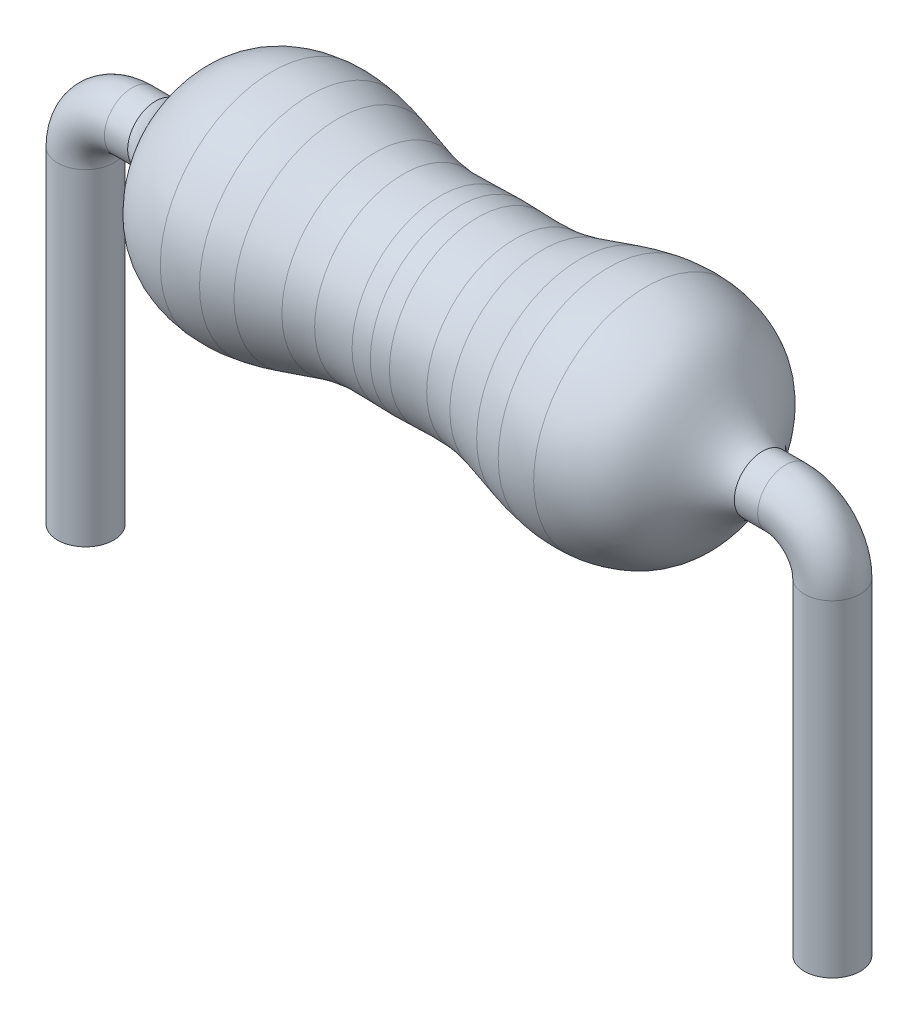
ISO-10303-21;
HEADER;
FILE_DESCRIPTION(('STEP AP214'),'2;1');
FILE_NAME('part.step','',(''),(''),'','','');
FILE_SCHEMA(('AUTOMOTIVE_DESIGN { 1 0 10303 214 1 1 1 1 }'));
ENDSEC;
DATA;
#1=APPLICATION_CONTEXT('core data for automotive mechanical design processes');
#2=APPLICATION_PROTOCOL_DEFINITION('international standard','automotive_design',2000,#1);
#3=PRODUCT_CONTEXT('',#1,'mechanical');
#4=PRODUCT('Part','Part','',(#3));
#5=PRODUCT_RELATED_PRODUCT_CATEGORY('part','',(#4));
#6=PRODUCT_DEFINITION_FORMATION('','',#4);
#7=PRODUCT_DEFINITION_CONTEXT('part definition',#1,'design');
#8=PRODUCT_DEFINITION('design','',#6,#7);
#9=PRODUCT_DEFINITION_SHAPE('','',#8);
#10=(LENGTH_UNIT() NAMED_UNIT(*) SI_UNIT(.MILLI.,.METRE.));
#11=(NAMED_UNIT(*) PLANE_ANGLE_UNIT() SI_UNIT($,.RADIAN.));
#12=(NAMED_UNIT(*) SI_UNIT($,.STERADIAN.) SOLID_ANGLE_UNIT());
#13=UNCERTAINTY_MEASURE_WITH_UNIT(LENGTH_MEASURE(1.E-05),#10,'distance_accuracy_value','');
#14=(GEOMETRIC_REPRESENTATION_CONTEXT(3) GLOBAL_UNCERTAINTY_ASSIGNED_CONTEXT((#13)) GLOBAL_UNIT_ASSIGNED_CONTEXT((#10,
#11,#12)) REPRESENTATION_CONTEXT('',''));
#15=CARTESIAN_POINT('',(0.,0.,0.));
#16=DIRECTION('',(0.,0.,1.));
#17=DIRECTION('',(1.,0.,0.));
#18=AXIS2_PLACEMENT_3D('',#15,#16,#17);
#19=CARTESIAN_POINT('',(-1.6,1.18002524062666,0.));
#20=CARTESIAN_POINT('',(-1.73139921812952,1.20165085484211,0.));
#21=CARTESIAN_POINT('',(-1.86460144268591,1.21054538011363,0.));
#22=CARTESIAN_POINT('',(-2.00000000000192,1.19999999999985,0.));
#23=B_SPLINE_CURVE_WITH_KNOTS('',3,(#19,#20,#21,#22),.UNSPECIFIED.,.F.,.F.,(4,4),
(0.725130753100902,0.780397484348983),.UNSPECIFIED.);
#24=CARTESIAN_POINT('',(0.,0.,0.));
#25=DIRECTION('',(-1.,0.,0.));
#26=AXIS1_PLACEMENT('',#24,#25);
#27=SURFACE_OF_REVOLUTION('',#23,#26);
#28=CARTESIAN_POINT('',(-2.00000008221301,0.,0.));
#29=DIRECTION('',(-1.,0.,0.));
#30=DIRECTION('',(0.,0.,1.));
#31=AXIS2_PLACEMENT_3D('',#28,#29,#30);
#32=CIRCLE('',#31,1.19999995231);
#33=CARTESIAN_POINT('',(-2.00000008221301,0.,1.19999995231));
#34=VERTEX_POINT('',#33);
#35=EDGE_CURVE('E80',#34,#34,#32,.T.);
#36=ORIENTED_EDGE('',*,*,#35,.F.);
#37=EDGE_LOOP('',(#36));
#38=FACE_BOUND('',#37,.T.);
#39=CARTESIAN_POINT('',(-1.6,0.,0.));
#40=DIRECTION('',(-1.,0.,0.));
#41=DIRECTION('',(0.,0.,1.));
#42=AXIS2_PLACEMENT_3D('',#39,#40,#41);
#43=CIRCLE('',#42,1.18002524062666);
#44=CARTESIAN_POINT('',(-1.6,0.,1.18002524062666));
#45=VERTEX_POINT('',#44);
#46=EDGE_CURVE('E10',#45,#45,#43,.T.);
#47=ORIENTED_EDGE('',*,*,#46,.T.);
#48=EDGE_LOOP('',(#47));
#49=FACE_BOUND('',#48,.T.);
#50=ADVANCED_FACE('F33',(#38,#49),#27,.T.);
#51=CARTESIAN_POINT('',(-1.29999999999949,1.11105008155822,0.));
#52=CARTESIAN_POINT('',(-1.34982275992407,1.12502898187491,0.));
#53=CARTESIAN_POINT('',(-1.44929519333072,1.15139313965258,0.));
#54=CARTESIAN_POINT('',(-1.54974358409127,1.17175406612681,0.));
#55=CARTESIAN_POINT('',(-1.6,1.18002524062666,0.));
#56=B_SPLINE_CURVE_WITH_KNOTS('',3,(#51,#52,#53,#54,#55),.UNSPECIFIED.,.F.,.F.,(4,1,4),
(0.682659095606128,0.70399282038661,0.725130753100902),.UNSPECIFIED.);
#57=CARTESIAN_POINT('',(0.,0.,0.));
#58=DIRECTION('',(-1.,0.,0.));
#59=AXIS1_PLACEMENT('',#57,#58);
#60=SURFACE_OF_REVOLUTION('',#56,#59);
#61=ORIENTED_EDGE('',*,*,#46,.F.);
#62=EDGE_LOOP('',(#61));
#63=FACE_BOUND('',#62,.T.);
#64=CARTESIAN_POINT('',(-1.29999999999954,0.,0.));
#65=DIRECTION('',(-1.,0.,0.));
#66=DIRECTION('',(0.,0.,1.));
#67=AXIS2_PLACEMENT_3D('',#64,#65,#66);
#68=CIRCLE('',#67,1.11105008155823);
#69=CARTESIAN_POINT('',(-1.29999999999954,0.,1.11105008155823));
#70=VERTEX_POINT('',#69);
#71=EDGE_CURVE('E40',#70,#70,#68,.T.);
#72=ORIENTED_EDGE('',*,*,#71,.T.);
#73=EDGE_LOOP('',(#72));
#74=FACE_BOUND('',#73,.T.);
#75=ADVANCED_FACE('F95',(#63,#74),#60,.T.);
#76=CARTESIAN_POINT('',(-0.900000000002938,0.997661650819344,0.));
#77=CARTESIAN_POINT('',(-1.03363883795164,1.03072801398973,0.));
#78=CARTESIAN_POINT('',(-1.16630551585749,1.07353907515188,0.));
#79=CARTESIAN_POINT('',(-1.29999999999954,1.11105008155823,0.));
#80=B_SPLINE_CURVE_WITH_KNOTS('',3,(#76,#77,#78,#79),.UNSPECIFIED.,.F.,.F.,(4,4),
(0.625412139924171,0.682659095606134),.UNSPECIFIED.);
#81=CARTESIAN_POINT('',(0.,0.,0.));
#82=DIRECTION('',(-1.,0.,0.));
#83=AXIS1_PLACEMENT('',#81,#82);
#84=SURFACE_OF_REVOLUTION('',#80,#83);
#85=ORIENTED_EDGE('',*,*,#71,.F.);
#86=EDGE_LOOP('',(#85));
#87=FACE_BOUND('',#86,.T.);
#88=CARTESIAN_POINT('',(-0.900000000002907,0.,0.));
#89=DIRECTION('',(-1.,0.,0.));
#90=DIRECTION('',(0.,0.,1.));
#91=AXIS2_PLACEMENT_3D('',#88,#89,#90);
#92=CIRCLE('',#91,0.997661650819337);
#93=CARTESIAN_POINT('',(-0.900000000002907,0.,0.997661650819337));
#94=VERTEX_POINT('',#93);
#95=EDGE_CURVE('E44',#94,#94,#92,.T.);
#96=ORIENTED_EDGE('',*,*,#95,.T.);
#97=EDGE_LOOP('',(#96));
#98=FACE_BOUND('',#97,.T.);
#99=ADVANCED_FACE('F98',(#87,#98),#84,.T.);
#100=CARTESIAN_POINT('',(-0.6,0.946228081779574,0.));
#101=CARTESIAN_POINT('',(-0.616698211097421,0.947554211975146,0.));
#102=CARTESIAN_POINT('',(-0.717557480019262,0.957111908544431,0.));
#103=CARTESIAN_POINT('',(-0.81719844254936,0.977173996093668,0.));
#104=CARTESIAN_POINT('',(-0.900000000002907,0.997661650819337,0.));
#105=B_SPLINE_CURVE_WITH_KNOTS('',3,(#100,#101,#102,#103,#104),.UNSPECIFIED.,.F.,.F.,(4,1,4),
(0.582920396760219,0.589942383057822,0.625412139924171),.UNSPECIFIED.);
#106=CARTESIAN_POINT('',(0.,0.,0.));
#107=DIRECTION('',(-1.,0.,0.));
#108=AXIS1_PLACEMENT('',#106,#107);
#109=SURFACE_OF_REVOLUTION('',#105,#108);
#110=ORIENTED_EDGE('',*,*,#95,.F.);
#111=EDGE_LOOP('',(#110));
#112=FACE_BOUND('',#111,.T.);
#113=CARTESIAN_POINT('',(-0.599999999999969,0.,0.));
#114=DIRECTION('',(-1.,0.,0.));
#115=DIRECTION('',(0.,0.,1.));
#116=AXIS2_PLACEMENT_3D('',#113,#114,#115);
#117=CIRCLE('',#116,0.946228081779572);
#118=CARTESIAN_POINT('',(-0.599999999999969,0.,0.946228081779572));
#119=VERTEX_POINT('',#118);
#120=EDGE_CURVE('E48',#119,#119,#117,.T.);
#121=ORIENTED_EDGE('',*,*,#120,.T.);
#122=EDGE_LOOP('',(#121));
#123=FACE_BOUND('',#122,.T.);
#124=ADVANCED_FACE('F102',(#112,#123),#109,.T.);
#125=CARTESIAN_POINT('',(-0.199999999999563,0.945686937032062,0.));
#126=CARTESIAN_POINT('',(-0.334396136138305,0.941079864095734,0.));
#127=CARTESIAN_POINT('',(-0.468154450978546,0.935757237765867,0.));
#128=CARTESIAN_POINT('',(-0.599999999999969,0.946228081779572,0.));
#129=B_SPLINE_CURVE_WITH_KNOTS('',3,(#125,#126,#127,#128),.UNSPECIFIED.,.F.,.F.,(4,4),
(0.527476275636896,0.582920396760219),.UNSPECIFIED.);
#130=CARTESIAN_POINT('',(0.,0.,0.));
#131=DIRECTION('',(-1.,0.,0.));
#132=AXIS1_PLACEMENT('',#130,#131);
#133=SURFACE_OF_REVOLUTION('',#129,#132);
#134=ORIENTED_EDGE('',*,*,#120,.F.);
#135=EDGE_LOOP('',(#134));
#136=FACE_BOUND('',#135,.T.);
#137=CARTESIAN_POINT('',(-0.2,0.,0.));
#138=DIRECTION('',(-1.,0.,0.));
#139=DIRECTION('',(0.,0.,1.));
#140=AXIS2_PLACEMENT_3D('',#137,#138,#139);
#141=CIRCLE('',#140,0.945686937032046);
#142=CARTESIAN_POINT('',(-0.2,0.,0.945686937032046));
#143=VERTEX_POINT('',#142);
#144=EDGE_CURVE('E53',#143,#143,#141,.T.);
#145=ORIENTED_EDGE('',*,*,#144,.T.);
#146=EDGE_LOOP('',(#145));
#147=FACE_BOUND('',#146,.T.);
#148=ADVANCED_FACE('F106',(#136,#147),#133,.T.);
#149=CARTESIAN_POINT('',(0.,0.95,0.));
#150=CARTESIAN_POINT('',(-0.0667198607743776,0.950074873737409,0.));
#151=CARTESIAN_POINT('',(-0.133438155491727,0.947968663882511,0.));
#152=CARTESIAN_POINT('',(-0.2,0.945686937032046,0.));
#153=B_SPLINE_CURVE_WITH_KNOTS('',3,(#149,#150,#151,#152),.UNSPECIFIED.,.F.,.F.,(4,4),
(0.500016684348567,0.527476275636956),.UNSPECIFIED.);
#154=CARTESIAN_POINT('',(0.,0.,0.));
#155=DIRECTION('',(-1.,0.,0.));
#156=AXIS1_PLACEMENT('',#154,#155);
#157=SURFACE_OF_REVOLUTION('',#153,#156);
#158=ORIENTED_EDGE('',*,*,#144,.F.);
#159=EDGE_LOOP('',(#158));
#160=FACE_BOUND('',#159,.T.);
#161=CARTESIAN_POINT('',(0.,0.,0.));
#162=DIRECTION('',(-1.,0.,0.));
#163=DIRECTION('',(0.,0.,1.));
#164=AXIS2_PLACEMENT_3D('',#161,#162,#163);
#165=CIRCLE('',#164,0.95);
#166=CARTESIAN_POINT('',(0.,0.,0.95));
#167=VERTEX_POINT('',#166);
#168=EDGE_CURVE('E56',#167,#167,#165,.T.);
#169=ORIENTED_EDGE('',*,*,#168,.T.);
#170=EDGE_LOOP('',(#169));
#171=FACE_BOUND('',#170,.T.);
#172=ADVANCED_FACE('F134',(#160,#171),#157,.T.);
#173=CARTESIAN_POINT('',(0.2,0.945686937032046,0.));
#174=CARTESIAN_POINT('',(0.133438155491727,0.947968663882511,0.));
#175=CARTESIAN_POINT('',(0.0667198607743776,0.950074873737409,0.));
#176=CARTESIAN_POINT('',(0.,0.95,0.));
#177=B_SPLINE_CURVE_WITH_KNOTS('',3,(#173,#174,#175,#176),.UNSPECIFIED.,.F.,.F.,(4,4),
(0.500016684348567,0.527476275636956),.UNSPECIFIED.);
#178=CARTESIAN_POINT('',(0.,0.,0.));
#179=DIRECTION('',(-1.,0.,0.));
#180=AXIS1_PLACEMENT('',#178,#179);
#181=SURFACE_OF_REVOLUTION('',#177,#180);
#182=ORIENTED_EDGE('',*,*,#168,.F.);
#183=EDGE_LOOP('',(#182));
#184=FACE_BOUND('',#183,.T.);
#185=CARTESIAN_POINT('',(0.199999999999563,0.,0.));
#186=DIRECTION('',(-1.,0.,0.));
#187=DIRECTION('',(0.,0.,1.));
#188=AXIS2_PLACEMENT_3D('',#185,#186,#187);
#189=CIRCLE('',#188,0.945686937032062);
#190=CARTESIAN_POINT('',(0.199999999999563,0.,0.945686937032062));
#191=VERTEX_POINT('',#190);
#192=EDGE_CURVE('E59',#191,#191,#189,.T.);
#193=ORIENTED_EDGE('',*,*,#192,.T.);
#194=EDGE_LOOP('',(#193));
#195=FACE_BOUND('',#194,.T.);
#196=ADVANCED_FACE('F137',(#184,#195),#181,.T.);
#197=CARTESIAN_POINT('',(0.599999999999969,0.946228081779572,0.));
#198=CARTESIAN_POINT('',(0.468154450978546,0.935757237765867,0.));
#199=CARTESIAN_POINT('',(0.334396136138305,0.941079864095734,0.));
#200=CARTESIAN_POINT('',(0.199999999999563,0.945686937032062,0.));
#201=B_SPLINE_CURVE_WITH_KNOTS('',3,(#197,#198,#199,#200),.UNSPECIFIED.,.F.,.F.,(4,4),
(0.527476275636896,0.582920396760219),.UNSPECIFIED.);
#202=CARTESIAN_POINT('',(0.,0.,0.));
#203=DIRECTION('',(-1.,0.,0.));
#204=AXIS1_PLACEMENT('',#202,#203);
#205=SURFACE_OF_REVOLUTION('',#201,#204);
#206=ORIENTED_EDGE('',*,*,#192,.F.);
#207=EDGE_LOOP('',(#206));
#208=FACE_BOUND('',#207,.T.);
#209=CARTESIAN_POINT('',(0.6,0.,0.));
#210=DIRECTION('',(-1.,0.,0.));
#211=DIRECTION('',(0.,0.,1.));
#212=AXIS2_PLACEMENT_3D('',#209,#210,#211);
#213=CIRCLE('',#212,0.946228081779574);
#214=CARTESIAN_POINT('',(0.6,0.,0.946228081779574));
#215=VERTEX_POINT('',#214);
#216=EDGE_CURVE('E62',#215,#215,#213,.T.);
#217=ORIENTED_EDGE('',*,*,#216,.T.);
#218=EDGE_LOOP('',(#217));
#219=FACE_BOUND('',#218,.T.);
#220=ADVANCED_FACE('F141',(#208,#219),#205,.T.);
#221=CARTESIAN_POINT('',(0.900000000002907,0.997661650819337,0.));
#222=CARTESIAN_POINT('',(0.81719844254936,0.977173996093668,0.));
#223=CARTESIAN_POINT('',(0.717557480019262,0.957111908544431,0.));
#224=CARTESIAN_POINT('',(0.616698211097421,0.947554211975146,0.));
#225=CARTESIAN_POINT('',(0.6,0.946228081779574,0.));
#226=B_SPLINE_CURVE_WITH_KNOTS('',3,(#221,#222,#223,#224,#225),.UNSPECIFIED.,.F.,.F.,(4,1,4),
(0.582920396760219,0.618390153626567,0.625412139924171),.UNSPECIFIED.);
#227=CARTESIAN_POINT('',(0.,0.,0.));
#228=DIRECTION('',(-1.,0.,0.));
#229=AXIS1_PLACEMENT('',#227,#228);
#230=SURFACE_OF_REVOLUTION('',#226,#229);
#231=ORIENTED_EDGE('',*,*,#216,.F.);
#232=EDGE_LOOP('',(#231));
#233=FACE_BOUND('',#232,.T.);
#234=CARTESIAN_POINT('',(0.900000000002938,0.,0.));
#235=DIRECTION('',(-1.,0.,0.));
#236=DIRECTION('',(0.,0.,1.));
#237=AXIS2_PLACEMENT_3D('',#234,#235,#236);
#238=CIRCLE('',#237,0.997661650819344);
#239=CARTESIAN_POINT('',(0.900000000002938,0.,0.997661650819344));
#240=VERTEX_POINT('',#239);
#241=EDGE_CURVE('E65',#240,#240,#238,.T.);
#242=ORIENTED_EDGE('',*,*,#241,.T.);
#243=EDGE_LOOP('',(#242));
#244=FACE_BOUND('',#243,.T.);
#245=ADVANCED_FACE('F145',(#233,#244),#230,.T.);
#246=CARTESIAN_POINT('',(1.29999999999954,1.11105008155823,0.));
#247=CARTESIAN_POINT('',(1.16630551585749,1.07353907515188,0.));
#248=CARTESIAN_POINT('',(1.03363883795164,1.03072801398973,0.));
#249=CARTESIAN_POINT('',(0.900000000002938,0.997661650819344,0.));
#250=B_SPLINE_CURVE_WITH_KNOTS('',3,(#246,#247,#248,#249),.UNSPECIFIED.,.F.,.F.,(4,4),
(0.625412139924171,0.682659095606134),.UNSPECIFIED.);
#251=CARTESIAN_POINT('',(0.,0.,0.));
#252=DIRECTION('',(-1.,0.,0.));
#253=AXIS1_PLACEMENT('',#251,#252);
#254=SURFACE_OF_REVOLUTION('',#250,#253);
#255=ORIENTED_EDGE('',*,*,#241,.F.);
#256=EDGE_LOOP('',(#255));
#257=FACE_BOUND('',#256,.T.);
#258=CARTESIAN_POINT('',(1.29999999999949,0.,0.));
#259=DIRECTION('',(-1.,0.,0.));
#260=DIRECTION('',(0.,0.,1.));
#261=AXIS2_PLACEMENT_3D('',#258,#259,#260);
#262=CIRCLE('',#261,1.11105008155822);
#263=CARTESIAN_POINT('',(1.29999999999949,0.,1.11105008155822));
#264=VERTEX_POINT('',#263);
#265=EDGE_CURVE('E68',#264,#264,#262,.T.);
#266=ORIENTED_EDGE('',*,*,#265,.T.);
#267=EDGE_LOOP('',(#266));
#268=FACE_BOUND('',#267,.T.);
#269=ADVANCED_FACE('F173',(#257,#268),#254,.T.);
#270=CARTESIAN_POINT('',(1.6,1.18002524062666,0.));
#271=CARTESIAN_POINT('',(1.54974358409127,1.17175406612681,0.));
#272=CARTESIAN_POINT('',(1.44929519333072,1.15139313965258,0.));
#273=CARTESIAN_POINT('',(1.34982275992407,1.12502898187491,0.));
#274=CARTESIAN_POINT('',(1.29999999999949,1.11105008155822,0.));
#275=B_SPLINE_CURVE_WITH_KNOTS('',3,(#270,#271,#272,#273,#274),.UNSPECIFIED.,.F.,.F.,(4,1,4),
(0.682659095606128,0.70379702832042,0.725130753100902),.UNSPECIFIED.);
#276=CARTESIAN_POINT('',(0.,0.,0.));
#277=DIRECTION('',(-1.,0.,0.));
#278=AXIS1_PLACEMENT('',#276,#277);
#279=SURFACE_OF_REVOLUTION('',#275,#278);
#280=ORIENTED_EDGE('',*,*,#265,.F.);
#281=EDGE_LOOP('',(#280));
#282=FACE_BOUND('',#281,.T.);
#283=CARTESIAN_POINT('',(1.6,0.,0.));
#284=DIRECTION('',(-1.,0.,0.));
#285=DIRECTION('',(0.,0.,1.));
#286=AXIS2_PLACEMENT_3D('',#283,#284,#285);
#287=CIRCLE('',#286,1.18002524062666);
#288=CARTESIAN_POINT('',(1.6,0.,1.18002524062666));
#289=VERTEX_POINT('',#288);
#290=EDGE_CURVE('E71',#289,#289,#287,.T.);
#291=ORIENTED_EDGE('',*,*,#290,.T.);
#292=EDGE_LOOP('',(#291));
#293=FACE_BOUND('',#292,.T.);
#294=ADVANCED_FACE('F176',(#282,#293),#279,.T.);
#295=CARTESIAN_POINT('',(2.00000000000192,1.19999999999985,0.));
#296=CARTESIAN_POINT('',(1.86460144268591,1.21054538011363,0.));
#297=CARTESIAN_POINT('',(1.73139921812952,1.20165085484211,0.));
#298=CARTESIAN_POINT('',(1.6,1.18002524062666,0.));
#299=B_SPLINE_CURVE_WITH_KNOTS('',3,(#295,#296,#297,#298),.UNSPECIFIED.,.F.,.F.,(4,4),
(0.725130753100902,0.780397484348983),.UNSPECIFIED.);
#300=CARTESIAN_POINT('',(0.,0.,0.));
#301=DIRECTION('',(-1.,0.,0.));
#302=AXIS1_PLACEMENT('',#300,#301);
#303=SURFACE_OF_REVOLUTION('',#299,#302);
#304=ORIENTED_EDGE('',*,*,#290,.F.);
#305=EDGE_LOOP('',(#304));
#306=FACE_BOUND('',#305,.T.);
#307=CARTESIAN_POINT('',(2.00000008221301,0.,0.));
#308=DIRECTION('',(-1.,0.,0.));
#309=DIRECTION('',(0.,0.,1.));
#310=AXIS2_PLACEMENT_3D('',#307,#308,#309);
#311=CIRCLE('',#310,1.19999995231);
#312=CARTESIAN_POINT('',(2.00000008221301,0.,1.19999995231));
#313=VERTEX_POINT('',#312);
#314=EDGE_CURVE('E74',#313,#313,#311,.T.);
#315=ORIENTED_EDGE('',*,*,#314,.T.);
#316=EDGE_LOOP('',(#315));
#317=FACE_BOUND('',#316,.T.);
#318=ADVANCED_FACE('F180',(#306,#317),#303,.T.);
#319=CARTESIAN_POINT('',(3.2499998922858,0.300000089056362,0.));
#320=CARTESIAN_POINT('',(2.97114489163779,0.430097598164328,0.));
#321=CARTESIAN_POINT('',(2.78926367890958,1.00505202041229,0.));
#322=CARTESIAN_POINT('',(2.2360430201822,1.18161598608909,0.));
#323=CARTESIAN_POINT('',(2.00000008221301,1.19999995231,0.));
#324=B_SPLINE_CURVE_WITH_KNOTS('',3,(#319,#320,#321,#322,#323),.UNSPECIFIED.,.F.,.F.,(4,1,4),
(0.780397484348983,0.903652418042311,1.),.UNSPECIFIED.);
#325=CARTESIAN_POINT('',(0.,0.,0.));
#326=DIRECTION('',(-1.,0.,0.));
#327=AXIS1_PLACEMENT('',#325,#326);
#328=SURFACE_OF_REVOLUTION('',#324,#327);
#329=ORIENTED_EDGE('',*,*,#314,.F.);
#330=EDGE_LOOP('',(#329));
#331=FACE_BOUND('',#330,.T.);
#332=CARTESIAN_POINT('',(3.25,0.,0.));
#333=DIRECTION('',(-1.,0.,0.));
#334=DIRECTION('',(0.,0.,1.));
#335=AXIS2_PLACEMENT_3D('',#332,#333,#334);
#336=CIRCLE('',#335,0.300000000000002);
#337=CARTESIAN_POINT('',(3.25,0.,0.300000000000002));
#338=VERTEX_POINT('',#337);
#339=EDGE_CURVE('E83',#338,#338,#336,.T.);
#340=ORIENTED_EDGE('',*,*,#339,.T.);
#341=EDGE_LOOP('',(#340));
#342=FACE_BOUND('',#341,.T.);
#343=ADVANCED_FACE('F184',(#331,#342),#328,.T.);
#344=CARTESIAN_POINT('',(-2.00000008221301,1.19999995231,0.));
#345=CARTESIAN_POINT('',(-2.2360430201822,1.18161598608909,0.));
#346=CARTESIAN_POINT('',(-2.78926367890958,1.00505202041229,0.));
#347=CARTESIAN_POINT('',(-2.97114489163779,0.430097598164328,0.));
#348=CARTESIAN_POINT('',(-3.2499998922858,0.300000089056362,0.));
#349=B_SPLINE_CURVE_WITH_KNOTS('',3,(#344,#345,#346,#347,#348),.UNSPECIFIED.,.F.,.F.,(4,1,4),
(0.780397484348983,0.876745066306672,1.),.UNSPECIFIED.);
#350=CARTESIAN_POINT('',(0.,0.,0.));
#351=DIRECTION('',(-1.,0.,0.));
#352=AXIS1_PLACEMENT('',#350,#351);
#353=SURFACE_OF_REVOLUTION('',#349,#352);
#354=CARTESIAN_POINT('',(-3.2499998922858,0.,0.));
#355=DIRECTION('',(-1.,0.,0.));
#356=DIRECTION('',(0.,0.,1.));
#357=AXIS2_PLACEMENT_3D('',#354,#355,#356);
#358=CIRCLE('',#357,0.300000089056362);
#359=CARTESIAN_POINT('',(-3.2499998922858,0.,0.300000089056362));
#360=VERTEX_POINT('',#359);
#361=EDGE_CURVE('E77',#360,#360,#358,.T.);
#362=ORIENTED_EDGE('',*,*,#361,.F.);
#363=EDGE_LOOP('',(#362));
#364=FACE_BOUND('',#363,.T.);
#365=ORIENTED_EDGE('',*,*,#35,.T.);
#366=EDGE_LOOP('',(#365));
#367=FACE_BOUND('',#366,.T.);
#368=ADVANCED_FACE('F211',(#364,#367),#353,.T.);
#369=CARTESIAN_POINT('',(3.5,0.,0.));
#370=DIRECTION('',(-1.,0.,0.));
#371=DIRECTION('',(0.,0.,1.));
#372=AXIS2_PLACEMENT_3D('',#369,#370,#371);
#373=CYLINDRICAL_SURFACE('',#372,0.300000000000002);
#374=CARTESIAN_POINT('',(3.5,0.,0.));
#375=DIRECTION('',(-1.,0.,0.));
#376=DIRECTION('',(0.,0.,1.));
#377=AXIS2_PLACEMENT_3D('',#374,#375,#376);
#378=CIRCLE('',#377,0.300000000000002);
#379=CARTESIAN_POINT('',(3.5,0.300000000000002,0.));
#380=VERTEX_POINT('',#379);
#381=EDGE_CURVE('E402',#380,#380,#378,.T.);
#382=ORIENTED_EDGE('',*,*,#381,.T.);
#383=EDGE_LOOP('',(#382));
#384=FACE_BOUND('',#383,.T.);
#385=ORIENTED_EDGE('',*,*,#339,.F.);
#386=EDGE_LOOP('',(#385));
#387=FACE_BOUND('',#386,.T.);
#388=ADVANCED_FACE('F214',(#384,#387),#373,.T.);
#389=CARTESIAN_POINT('',(3.5,-0.5,0.));
#390=DIRECTION('',(0.,0.,1.));
#391=DIRECTION('',(1.,0.,0.));
#392=AXIS2_PLACEMENT_3D('',#389,#390,#391);
#393=TOROIDAL_SURFACE('',#392,0.5,0.300000000000002);
#394=CARTESIAN_POINT('',(4.,-0.5,0.));
#395=DIRECTION('',(0.,1.,0.));
#396=DIRECTION('',(0.,0.,1.));
#397=AXIS2_PLACEMENT_3D('',#394,#395,#396);
#398=CIRCLE('',#397,0.300000000000002);
#399=CARTESIAN_POINT('',(4.3,-0.5,0.));
#400=VERTEX_POINT('',#399);
#401=EDGE_CURVE('E404',#400,#400,#398,.T.);
#402=CARTESIAN_POINT('',(3.5,-0.5,0.));
#403=DIRECTION('',(0.,0.,1.));
#404=DIRECTION('',(1.,0.,0.));
#405=AXIS2_PLACEMENT_3D('',#402,#403,#404);
#406=CIRCLE('',#405,0.800000000000002);
#407=EDGE_CURVE('',#400,#380,#406,.T.);
#408=ORIENTED_EDGE('',*,*,#401,.T.);
#409=ORIENTED_EDGE('',*,*,#381,.F.);
#410=ORIENTED_EDGE('',*,*,#407,.T.);
#411=ORIENTED_EDGE('',*,*,#407,.F.);
#412=EDGE_LOOP('',(#408,#410,#409,#411));
#413=FACE_BOUND('',#412,.T.);
#414=ADVANCED_FACE('F218',(#413),#393,.T.);
#415=CARTESIAN_POINT('',(4.,-0.5,0.));
#416=DIRECTION('',(0.,-1.,0.));
#417=DIRECTION('',(0.,0.,-1.));
#418=AXIS2_PLACEMENT_3D('',#415,#416,#417);
#419=CYLINDRICAL_SURFACE('',#418,0.300000000000002);
#420=ORIENTED_EDGE('',*,*,#401,.F.);
#421=EDGE_LOOP('',(#420));
#422=FACE_BOUND('',#421,.T.);
#423=CARTESIAN_POINT('',(4.,-4.,0.));
#424=DIRECTION('',(0.,1.,0.));
#425=DIRECTION('',(0.,0.,1.));
#426=AXIS2_PLACEMENT_3D('',#423,#424,#425);
#427=CIRCLE('',#426,0.300000000000002);
#428=CARTESIAN_POINT('',(4.,-4.,0.300000000000002));
#429=VERTEX_POINT('',#428);
#430=EDGE_CURVE('E407',#429,#429,#427,.T.);
#431=ORIENTED_EDGE('',*,*,#430,.T.);
#432=EDGE_LOOP('',(#431));
#433=FACE_BOUND('',#432,.T.);
#434=ADVANCED_FACE('F222',(#422,#433),#419,.T.);
#435=CARTESIAN_POINT('',(4.,-4.,0.));
#436=DIRECTION('',(0.,1.,0.));
#437=DIRECTION('',(0.,0.,1.));
#438=AXIS2_PLACEMENT_3D('',#435,#436,#437);
#439=PLANE('',#438);
#440=ORIENTED_EDGE('',*,*,#430,.F.);
#441=EDGE_LOOP('',(#440));
#442=FACE_BOUND('',#441,.T.);
#443=ADVANCED_FACE('F226',(#442),#439,.F.);
#444=CARTESIAN_POINT('',(-3.5,0.,0.));
#445=DIRECTION('',(1.,0.,0.));
#446=DIRECTION('',(0.,0.,-1.));
#447=AXIS2_PLACEMENT_3D('',#444,#445,#446);
#448=CYLINDRICAL_SURFACE('',#447,0.300000000000002);
#449=CARTESIAN_POINT('',(-3.5,0.,0.));
#450=DIRECTION('',(-1.,0.,0.));
#451=DIRECTION('',(0.,0.,1.));
#452=AXIS2_PLACEMENT_3D('',#449,#450,#451);
#453=CIRCLE('',#452,0.300000000000002);
#454=CARTESIAN_POINT('',(-3.5,0.300000000000002,0.));
#455=VERTEX_POINT('',#454);
#456=EDGE_CURVE('E410',#455,#455,#453,.T.);
#457=ORIENTED_EDGE('',*,*,#456,.F.);
#458=EDGE_LOOP('',(#457));
#459=FACE_BOUND('',#458,.T.);
#460=ORIENTED_EDGE('',*,*,#361,.T.);
#461=EDGE_LOOP('',(#460));
#462=FACE_BOUND('',#461,.T.);
#463=ADVANCED_FACE('F230',(#459,#462),#448,.T.);
#464=CARTESIAN_POINT('',(-3.5,-0.5,0.));
#465=DIRECTION('',(0.,0.,-1.));
#466=DIRECTION('',(-1.,0.,0.));
#467=AXIS2_PLACEMENT_3D('',#464,#465,#466);
#468=TOROIDAL_SURFACE('',#467,0.5,0.300000000000002);
#469=CARTESIAN_POINT('',(-4.,-0.5,0.));
#470=DIRECTION('',(0.,-1.,0.));
#471=DIRECTION('',(0.,0.,1.));
#472=AXIS2_PLACEMENT_3D('',#469,#470,#471);
#473=CIRCLE('',#472,0.300000000000002);
#474=CARTESIAN_POINT('',(-4.3,-0.5,0.));
#475=VERTEX_POINT('',#474);
#476=EDGE_CURVE('E415',#475,#475,#473,.T.);
#477=CARTESIAN_POINT('',(-3.5,-0.5,0.));
#478=DIRECTION('',(0.,0.,-1.));
#479=DIRECTION('',(-1.,0.,0.));
#480=AXIS2_PLACEMENT_3D('',#477,#478,#479);
#481=CIRCLE('',#480,0.800000000000002);
#482=EDGE_CURVE('',#475,#455,#481,.T.);
#483=ORIENTED_EDGE('',*,*,#476,.F.);
#484=ORIENTED_EDGE('',*,*,#456,.T.);
#485=ORIENTED_EDGE('',*,*,#482,.T.);
#486=ORIENTED_EDGE('',*,*,#482,.F.);
#487=EDGE_LOOP('',(#483,#485,#484,#486));
#488=FACE_BOUND('',#487,.T.);
#489=ADVANCED_FACE('F234',(#488),#468,.T.);
#490=CARTESIAN_POINT('',(-4.,-0.5,0.));
#491=DIRECTION('',(0.,-1.,0.));
#492=DIRECTION('',(0.,0.,-1.));
#493=AXIS2_PLACEMENT_3D('',#490,#491,#492);
#494=CYLINDRICAL_SURFACE('',#493,0.300000000000002);
#495=ORIENTED_EDGE('',*,*,#476,.T.);
#496=EDGE_LOOP('',(#495));
#497=FACE_BOUND('',#496,.T.);
#498=CARTESIAN_POINT('',(-4.,-4.,0.));
#499=DIRECTION('',(0.,-1.,0.));
#500=DIRECTION('',(0.,0.,1.));
#501=AXIS2_PLACEMENT_3D('',#498,#499,#500);
#502=CIRCLE('',#501,0.300000000000002);
#503=CARTESIAN_POINT('',(-4.,-4.,0.300000000000002));
#504=VERTEX_POINT('',#503);
#505=EDGE_CURVE('E416',#504,#504,#502,.T.);
#506=ORIENTED_EDGE('',*,*,#505,.F.);
#507=EDGE_LOOP('',(#506));
#508=FACE_BOUND('',#507,.T.);
#509=ADVANCED_FACE('F238',(#497,#508),#494,.T.);
#510=CARTESIAN_POINT('',(-4.,-4.,0.));
#511=DIRECTION('',(0.,1.,0.));
#512=DIRECTION('',(0.,0.,1.));
#513=AXIS2_PLACEMENT_3D('',#510,#511,#512);
#514=PLANE('',#513);
#515=ORIENTED_EDGE('',*,*,#505,.T.);
#516=EDGE_LOOP('',(#515));
#517=FACE_BOUND('',#516,.T.);
#518=ADVANCED_FACE('F242',(#517),#514,.F.);
#519=CLOSED_SHELL('',(#50,#75,#99,#124,#148,#172,#196,#220,#245,#269,#294,#318,#343,#368,#388,
#414,#434,#443,#463,#489,#509,#518));
#520=MANIFOLD_SOLID_BREP('B2',#519);
#521=ADVANCED_BREP_SHAPE_REPRESENTATION('',(#18,#520),#14);
#522=SHAPE_DEFINITION_REPRESENTATION(#9,#521);
ENDSEC;
END-ISO-10303-21;
